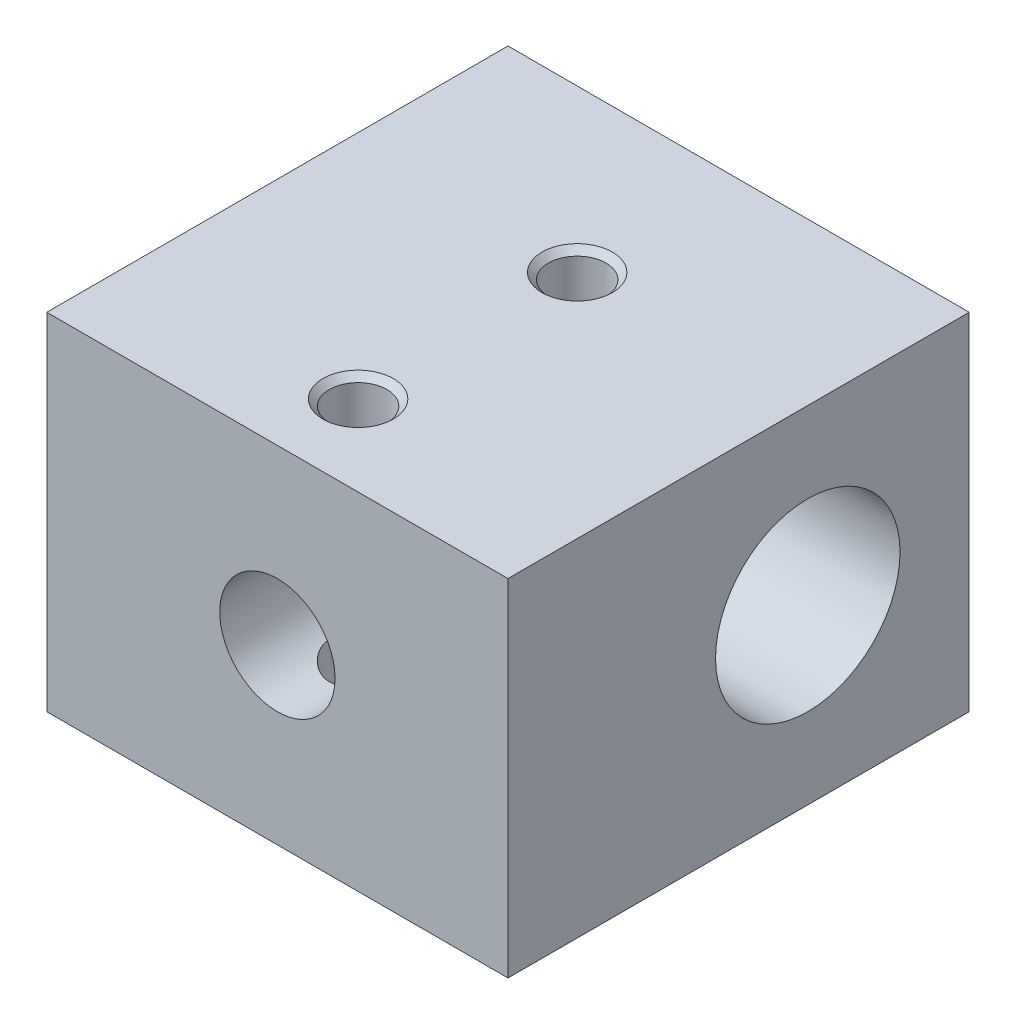
ISO-10303-21;
HEADER;
FILE_DESCRIPTION(('STEP AP214'),'2;1');
FILE_NAME('part.step','',(''),(''),'','','');
FILE_SCHEMA(('AUTOMOTIVE_DESIGN { 1 0 10303 214 1 1 1 1 }'));
ENDSEC;
DATA;
#1=APPLICATION_CONTEXT('core data for automotive mechanical design processes');
#2=APPLICATION_PROTOCOL_DEFINITION('international standard','automotive_design',2000,#1);
#3=PRODUCT_CONTEXT('',#1,'mechanical');
#4=PRODUCT('Part','Part','',(#3));
#5=PRODUCT_RELATED_PRODUCT_CATEGORY('part','',(#4));
#6=PRODUCT_DEFINITION_FORMATION('','',#4);
#7=PRODUCT_DEFINITION_CONTEXT('part definition',#1,'design');
#8=PRODUCT_DEFINITION('design','',#6,#7);
#9=PRODUCT_DEFINITION_SHAPE('','',#8);
#10=(LENGTH_UNIT() NAMED_UNIT(*) SI_UNIT(.MILLI.,.METRE.));
#11=(NAMED_UNIT(*) PLANE_ANGLE_UNIT() SI_UNIT($,.RADIAN.));
#12=(NAMED_UNIT(*) SI_UNIT($,.STERADIAN.) SOLID_ANGLE_UNIT());
#13=UNCERTAINTY_MEASURE_WITH_UNIT(LENGTH_MEASURE(1.E-05),#10,'distance_accuracy_value','');
#14=(GEOMETRIC_REPRESENTATION_CONTEXT(3) GLOBAL_UNCERTAINTY_ASSIGNED_CONTEXT((#13)) GLOBAL_UNIT_ASSIGNED_CONTEXT((#10,
#11,#12)) REPRESENTATION_CONTEXT('',''));
#15=CARTESIAN_POINT('',(0.,0.,0.));
#16=DIRECTION('',(0.,0.,1.));
#17=DIRECTION('',(1.,0.,0.));
#18=AXIS2_PLACEMENT_3D('',#15,#16,#17);
#19=CARTESIAN_POINT('',(0.,15.,0.));
#20=DIRECTION('',(0.,-1.,0.));
#21=DIRECTION('',(0.,0.,-1.));
#22=AXIS2_PLACEMENT_3D('',#19,#20,#21);
#23=PLANE('',#22);
#24=CARTESIAN_POINT('',(10.,15.,-3.5));
#25=DIRECTION('',(0.,1.,0.));
#26=DIRECTION('',(0.,0.,1.));
#27=AXIS2_PLACEMENT_3D('',#24,#25,#26);
#28=CIRCLE('',#27,1.525);
#29=CARTESIAN_POINT('',(10.,15.,-1.975));
#30=VERTEX_POINT('',#29);
#31=EDGE_CURVE('E219',#30,#30,#28,.T.);
#32=ORIENTED_EDGE('',*,*,#31,.F.);
#33=EDGE_LOOP('',(#32));
#34=FACE_BOUND('',#33,.T.);
#35=DIRECTION('',(0.,0.,1.));
#36=VECTOR('',#35,1.);
#37=CARTESIAN_POINT('',(0.,15.,0.));
#38=LINE('',#37,#36);
#39=CARTESIAN_POINT('',(0.,15.,-20.));
#40=VERTEX_POINT('',#39);
#41=CARTESIAN_POINT('',(0.,15.,0.));
#42=VERTEX_POINT('',#41);
#43=EDGE_CURVE('E104',#40,#42,#38,.T.);
#44=ORIENTED_EDGE('',*,*,#43,.T.);
#45=DIRECTION('',(1.,0.,0.));
#46=VECTOR('',#45,1.);
#47=CARTESIAN_POINT('',(0.,15.,0.));
#48=LINE('',#47,#46);
#49=CARTESIAN_POINT('',(20.,15.,0.));
#50=VERTEX_POINT('',#49);
#51=EDGE_CURVE('E99',#42,#50,#48,.T.);
#52=ORIENTED_EDGE('',*,*,#51,.T.);
#53=DIRECTION('',(0.,0.,-1.));
#54=VECTOR('',#53,1.);
#55=CARTESIAN_POINT('',(20.,15.,0.));
#56=LINE('',#55,#54);
#57=CARTESIAN_POINT('',(20.,15.,-20.));
#58=VERTEX_POINT('',#57);
#59=EDGE_CURVE('E102',#50,#58,#56,.T.);
#60=ORIENTED_EDGE('',*,*,#59,.T.);
#61=DIRECTION('',(-1.,0.,0.));
#62=VECTOR('',#61,1.);
#63=CARTESIAN_POINT('',(0.,15.,-20.));
#64=LINE('',#63,#62);
#65=EDGE_CURVE('E69',#58,#40,#64,.T.);
#66=ORIENTED_EDGE('',*,*,#65,.T.);
#67=EDGE_LOOP('',(#44,#52,#60,#66));
#68=FACE_BOUND('',#67,.T.);
#69=CARTESIAN_POINT('',(10.,15.,-13.));
#70=DIRECTION('',(0.,1.,0.));
#71=DIRECTION('',(0.,0.,1.));
#72=AXIS2_PLACEMENT_3D('',#69,#70,#71);
#73=CIRCLE('',#72,1.525);
#74=CARTESIAN_POINT('',(10.,15.,-11.475));
#75=VERTEX_POINT('',#74);
#76=EDGE_CURVE('E211',#75,#75,#73,.T.);
#77=ORIENTED_EDGE('',*,*,#76,.F.);
#78=EDGE_LOOP('',(#77));
#79=FACE_BOUND('',#78,.T.);
#80=ADVANCED_FACE('F45',(#34,#68,#79),#23,.F.);
#81=CARTESIAN_POINT('',(0.,0.,0.));
#82=DIRECTION('',(0.,-1.,0.));
#83=DIRECTION('',(0.,0.,-1.));
#84=AXIS2_PLACEMENT_3D('',#81,#82,#83);
#85=PLANE('',#84);
#86=CARTESIAN_POINT('',(10.,0.,-3.5));
#87=DIRECTION('',(0.,1.,0.));
#88=DIRECTION('',(0.,0.,1.));
#89=AXIS2_PLACEMENT_3D('',#86,#87,#88);
#90=CIRCLE('',#89,1.25);
#91=CARTESIAN_POINT('',(10.,0.,-2.25));
#92=VERTEX_POINT('',#91);
#93=EDGE_CURVE('E165',#92,#92,#90,.T.);
#94=ORIENTED_EDGE('',*,*,#93,.T.);
#95=EDGE_LOOP('',(#94));
#96=FACE_BOUND('',#95,.T.);
#97=DIRECTION('',(0.,0.,1.));
#98=VECTOR('',#97,1.);
#99=CARTESIAN_POINT('',(0.,0.,0.));
#100=LINE('',#99,#98);
#101=CARTESIAN_POINT('',(0.,0.,-20.));
#102=VERTEX_POINT('',#101);
#103=CARTESIAN_POINT('',(0.,0.,0.));
#104=VERTEX_POINT('',#103);
#105=EDGE_CURVE('E117',#102,#104,#100,.T.);
#106=ORIENTED_EDGE('',*,*,#105,.F.);
#107=DIRECTION('',(-1.,0.,0.));
#108=VECTOR('',#107,1.);
#109=CARTESIAN_POINT('',(0.,0.,-20.));
#110=LINE('',#109,#108);
#111=CARTESIAN_POINT('',(20.,0.,-20.));
#112=VERTEX_POINT('',#111);
#113=EDGE_CURVE('E92',#112,#102,#110,.T.);
#114=ORIENTED_EDGE('',*,*,#113,.F.);
#115=DIRECTION('',(0.,0.,-1.));
#116=VECTOR('',#115,1.);
#117=CARTESIAN_POINT('',(20.,0.,0.));
#118=LINE('',#117,#116);
#119=CARTESIAN_POINT('',(20.,0.,0.));
#120=VERTEX_POINT('',#119);
#121=EDGE_CURVE('E86',#120,#112,#118,.T.);
#122=ORIENTED_EDGE('',*,*,#121,.F.);
#123=DIRECTION('',(1.,0.,0.));
#124=VECTOR('',#123,1.);
#125=CARTESIAN_POINT('',(0.,0.,0.));
#126=LINE('',#125,#124);
#127=EDGE_CURVE('E108',#104,#120,#126,.T.);
#128=ORIENTED_EDGE('',*,*,#127,.F.);
#129=EDGE_LOOP('',(#106,#114,#122,#128));
#130=FACE_BOUND('',#129,.T.);
#131=CARTESIAN_POINT('',(10.,0.,-13.));
#132=DIRECTION('',(0.,1.,0.));
#133=DIRECTION('',(0.,0.,1.));
#134=AXIS2_PLACEMENT_3D('',#131,#132,#133);
#135=CIRCLE('',#134,1.25);
#136=CARTESIAN_POINT('',(10.,0.,-11.75));
#137=VERTEX_POINT('',#136);
#138=EDGE_CURVE('E135',#137,#137,#135,.T.);
#139=ORIENTED_EDGE('',*,*,#138,.T.);
#140=EDGE_LOOP('',(#139));
#141=FACE_BOUND('',#140,.T.);
#142=ADVANCED_FACE('F176',(#96,#130,#141),#85,.T.);
#143=CARTESIAN_POINT('',(0.,15.,0.));
#144=DIRECTION('',(1.,0.,0.));
#145=DIRECTION('',(0.,0.,-1.));
#146=AXIS2_PLACEMENT_3D('',#143,#144,#145);
#147=PLANE('',#146);
#148=CARTESIAN_POINT('',(0.,7.5,-13.));
#149=DIRECTION('',(1.,0.,0.));
#150=DIRECTION('',(0.,0.,-1.));
#151=AXIS2_PLACEMENT_3D('',#148,#149,#150);
#152=CIRCLE('',#151,4.);
#153=CARTESIAN_POINT('',(0.,7.5,-17.));
#154=VERTEX_POINT('',#153);
#155=EDGE_CURVE('E196',#154,#154,#152,.T.);
#156=ORIENTED_EDGE('',*,*,#155,.T.);
#157=EDGE_LOOP('',(#156));
#158=FACE_BOUND('',#157,.T.);
#159=ORIENTED_EDGE('',*,*,#105,.T.);
#160=DIRECTION('',(0.,-1.,0.));
#161=VECTOR('',#160,1.);
#162=CARTESIAN_POINT('',(0.,15.,0.));
#163=LINE('',#162,#161);
#164=EDGE_CURVE('E11',#42,#104,#163,.T.);
#165=ORIENTED_EDGE('',*,*,#164,.F.);
#166=ORIENTED_EDGE('',*,*,#43,.F.);
#167=DIRECTION('',(0.,-1.,0.));
#168=VECTOR('',#167,1.);
#169=CARTESIAN_POINT('',(0.,15.,-20.));
#170=LINE('',#169,#168);
#171=EDGE_CURVE('E113',#40,#102,#170,.T.);
#172=ORIENTED_EDGE('',*,*,#171,.T.);
#173=EDGE_LOOP('',(#159,#165,#166,#172));
#174=FACE_BOUND('',#173,.T.);
#175=ADVANCED_FACE('F47',(#158,#174),#147,.F.);
#176=CARTESIAN_POINT('',(0.,15.,0.));
#177=DIRECTION('',(0.,0.,-1.));
#178=DIRECTION('',(-1.,0.,0.));
#179=AXIS2_PLACEMENT_3D('',#176,#177,#178);
#180=PLANE('',#179);
#181=CARTESIAN_POINT('',(10.,7.5,0.));
#182=DIRECTION('',(0.,0.,1.));
#183=DIRECTION('',(1.,0.,0.));
#184=AXIS2_PLACEMENT_3D('',#181,#182,#183);
#185=CIRCLE('',#184,2.5);
#186=CARTESIAN_POINT('',(12.5,7.5,0.));
#187=VERTEX_POINT('',#186);
#188=EDGE_CURVE('E194',#187,#187,#185,.T.);
#189=ORIENTED_EDGE('',*,*,#188,.F.);
#190=EDGE_LOOP('',(#189));
#191=FACE_BOUND('',#190,.T.);
#192=ORIENTED_EDGE('',*,*,#127,.T.);
#193=DIRECTION('',(0.,-1.,0.));
#194=VECTOR('',#193,1.);
#195=CARTESIAN_POINT('',(20.,15.,0.));
#196=LINE('',#195,#194);
#197=EDGE_CURVE('E60',#50,#120,#196,.T.);
#198=ORIENTED_EDGE('',*,*,#197,.F.);
#199=ORIENTED_EDGE('',*,*,#51,.F.);
#200=ORIENTED_EDGE('',*,*,#164,.T.);
#201=EDGE_LOOP('',(#192,#198,#199,#200));
#202=FACE_BOUND('',#201,.T.);
#203=ADVANCED_FACE('F107',(#191,#202),#180,.F.);
#204=CARTESIAN_POINT('',(20.,15.,0.));
#205=DIRECTION('',(-1.,0.,0.));
#206=DIRECTION('',(0.,0.,1.));
#207=AXIS2_PLACEMENT_3D('',#204,#205,#206);
#208=PLANE('',#207);
#209=CARTESIAN_POINT('',(20.,7.5,-13.));
#210=DIRECTION('',(1.,0.,0.));
#211=DIRECTION('',(0.,0.,-1.));
#212=AXIS2_PLACEMENT_3D('',#209,#210,#211);
#213=CIRCLE('',#212,4.);
#214=CARTESIAN_POINT('',(20.,7.5,-17.));
#215=VERTEX_POINT('',#214);
#216=EDGE_CURVE('E201',#215,#215,#213,.T.);
#217=ORIENTED_EDGE('',*,*,#216,.F.);
#218=EDGE_LOOP('',(#217));
#219=FACE_BOUND('',#218,.T.);
#220=ORIENTED_EDGE('',*,*,#121,.T.);
#221=DIRECTION('',(0.,-1.,0.));
#222=VECTOR('',#221,1.);
#223=CARTESIAN_POINT('',(20.,15.,-20.));
#224=LINE('',#223,#222);
#225=EDGE_CURVE('E109',#58,#112,#224,.T.);
#226=ORIENTED_EDGE('',*,*,#225,.F.);
#227=ORIENTED_EDGE('',*,*,#59,.F.);
#228=ORIENTED_EDGE('',*,*,#197,.T.);
#229=EDGE_LOOP('',(#220,#226,#227,#228));
#230=FACE_BOUND('',#229,.T.);
#231=ADVANCED_FACE('F111',(#219,#230),#208,.F.);
#232=CARTESIAN_POINT('',(0.,15.,-20.));
#233=DIRECTION('',(0.,0.,1.));
#234=DIRECTION('',(1.,0.,0.));
#235=AXIS2_PLACEMENT_3D('',#232,#233,#234);
#236=PLANE('',#235);
#237=ORIENTED_EDGE('',*,*,#113,.T.);
#238=ORIENTED_EDGE('',*,*,#171,.F.);
#239=ORIENTED_EDGE('',*,*,#65,.F.);
#240=ORIENTED_EDGE('',*,*,#225,.T.);
#241=EDGE_LOOP('',(#237,#238,#239,#240));
#242=FACE_BOUND('',#241,.T.);
#243=ADVANCED_FACE('F171',(#242),#236,.F.);
#244=CARTESIAN_POINT('',(10.,7.5,-7.));
#245=DIRECTION('',(0.,0.,1.));
#246=DIRECTION('',(1.,0.,0.));
#247=AXIS2_PLACEMENT_3D('',#244,#245,#246);
#248=CYLINDRICAL_SURFACE('',#247,2.5);
#249=CARTESIAN_POINT('',(10.,5.,-2.25));
#250=CARTESIAN_POINT('',(9.93428504630877,5.00000358244811,-2.25000412789938));
#251=CARTESIAN_POINT('',(9.86849175037746,5.00261886225603,-2.2552125914021));
#252=CARTESIAN_POINT('',(9.73884970591447,5.01282304953255,-2.27581610042615));
#253=CARTESIAN_POINT('',(9.67500489160812,5.02042140213771,-2.29123049124706));
#254=CARTESIAN_POINT('',(9.55133306889928,5.0397965074586,-2.33149226077099));
#255=CARTESIAN_POINT('',(9.49149149632603,5.051557010281,-2.35630298031002));
#256=CARTESIAN_POINT('',(9.3769092289918,5.07817779355277,-2.41446327670618));
#257=CARTESIAN_POINT('',(9.32216813251244,5.09303782958087,-2.44781218031107));
#258=CARTESIAN_POINT('',(9.2156152277976,5.12554677177429,-2.52439656185662));
#259=CARTESIAN_POINT('',(9.16418098609736,5.1433100109058,-2.56810809904955));
#260=CARTESIAN_POINT('',(9.06902569391628,5.17925037191569,-2.66315184905879));
#261=CARTESIAN_POINT('',(9.02531052111654,5.19742779738706,-2.71448981471555));
#262=CARTESIAN_POINT('',(8.94343499943716,5.23376311003316,-2.82810418690423));
#263=CARTESIAN_POINT('',(8.90596833056046,5.25181016287335,-2.89092012293239));
#264=CARTESIAN_POINT('',(8.84228971638663,5.28392526534599,-3.02295916998277));
#265=CARTESIAN_POINT('',(8.81606973129209,5.29799615491263,-3.09217766090344));
#266=CARTESIAN_POINT('',(8.77733444726427,5.31927666202739,-3.2308313817774));
#267=CARTESIAN_POINT('',(8.76409267864945,5.32684660520358,-3.30000556508424));
#268=CARTESIAN_POINT('',(8.74946625836395,5.3352263756434,-3.43997354722434));
#269=CARTESIAN_POINT('',(8.74806988953366,5.3360428832089,-3.51076567608894));
#270=CARTESIAN_POINT('',(8.75664089103464,5.33111337178439,-3.64285753039421));
#271=CARTESIAN_POINT('',(8.76526930057898,5.32614045422483,-3.70428003902881));
#272=CARTESIAN_POINT('',(8.79132518867884,5.31154714082687,-3.8246523867163));
#273=CARTESIAN_POINT('',(8.80875547012794,5.30192526460279,-3.88360143163164));
#274=CARTESIAN_POINT('',(8.8522377745175,5.27890654484074,-3.99903641570707));
#275=CARTESIAN_POINT('',(8.87848116610501,5.26542699170002,-4.05543299848223));
#276=CARTESIAN_POINT('',(8.938697890415,5.23620744648245,-4.16329286573751));
#277=CARTESIAN_POINT('',(8.97267469523442,5.22046644024762,-4.21475391950011));
#278=CARTESIAN_POINT('',(9.05241743135902,5.18608552620893,-4.31815156592903));
#279=CARTESIAN_POINT('',(9.0991319270384,5.16733112204067,-4.36932109197019));
#280=CARTESIAN_POINT('',(9.20055552657329,5.13065470874491,-4.46341927323862));
#281=CARTESIAN_POINT('',(9.25526842928214,5.11273310051499,-4.50634399004235));
#282=CARTESIAN_POINT('',(9.37435436771019,5.07872515896295,-4.58460707628716));
#283=CARTESIAN_POINT('',(9.43905801050074,5.06276269797491,-4.61950059055717));
#284=CARTESIAN_POINT('',(9.57441723063901,5.03552648598447,-4.67762128630376));
#285=CARTESIAN_POINT('',(9.6450680296684,5.02424901320559,-4.70085773126896));
#286=CARTESIAN_POINT('',(9.78404188542412,5.00844582823205,-4.73309425464584));
#287=CARTESIAN_POINT('',(9.8520730868146,5.0034382712336,-4.74311404468347));
#288=CARTESIAN_POINT('',(9.98902550006331,4.99908733176123,-4.75183091391811));
#289=CARTESIAN_POINT('',(10.0579462748374,4.9997412659836,-4.75053335704935));
#290=CARTESIAN_POINT('',(10.1890412149825,5.00636009683199,-4.73724163947655));
#291=CARTESIAN_POINT('',(10.2513242600624,5.01190942889763,-4.72608433408746));
#292=CARTESIAN_POINT('',(10.3730086153774,5.02722285856476,-4.69470241013114));
#293=CARTESIAN_POINT('',(10.4324096071137,5.03698742082084,-4.6744767919333));
#294=CARTESIAN_POINT('',(10.5486107605621,5.06019685732913,-4.62500191695853));
#295=CARTESIAN_POINT('',(10.6052879962577,5.07373897787576,-4.59551118735398));
#296=CARTESIAN_POINT('',(10.7130767021237,5.10320032103614,-4.52861558044244));
#297=CARTESIAN_POINT('',(10.7641857872191,5.11912055542769,-4.49120733175821));
#298=CARTESIAN_POINT('',(10.8647096116133,5.15364723328169,-4.4052994683339));
#299=CARTESIAN_POINT('',(10.9134650972808,5.17236393939448,-4.35607141443304));
#300=CARTESIAN_POINT('',(11.0023204013916,5.20922010495157,-4.25009356091337));
#301=CARTESIAN_POINT('',(11.0424142321136,5.22735915773092,-4.19333860147953));
#302=CARTESIAN_POINT('',(11.1146348931221,5.26186009717415,-4.07044543224961));
#303=CARTESIAN_POINT('',(11.1462818698483,5.2780933792066,-4.00398591723925));
#304=CARTESIAN_POINT('',(11.1976035325173,5.30532409539842,-3.86561241538435));
#305=CARTESIAN_POINT('',(11.2172936448595,5.31632827199227,-3.79370559187351));
#306=CARTESIAN_POINT('',(11.2423271093121,5.33048123739166,-3.65386222142319));
#307=CARTESIAN_POINT('',(11.2488662455011,5.33428270674386,-3.5862071832137));
#308=CARTESIAN_POINT('',(11.250861442976,5.33543306692281,-3.45069116603659));
#309=CARTESIAN_POINT('',(11.2463223082805,5.33278475465559,-3.38283028907571));
#310=CARTESIAN_POINT('',(11.2274076569903,5.32202672437469,-3.25564562308498));
#311=CARTESIAN_POINT('',(11.2140103929285,5.31446131897008,-3.1961244123195));
#312=CARTESIAN_POINT('',(11.1789691977808,5.29536229765103,-3.08023985071912));
#313=CARTESIAN_POINT('',(11.1573226139498,5.28382740537905,-3.02387752238504));
#314=CARTESIAN_POINT('',(11.1047696816259,5.2571433704434,-2.91171893626674));
#315=CARTESIAN_POINT('',(11.0733389222706,5.24180347004761,-2.85621512271287));
#316=CARTESIAN_POINT('',(11.0026887145458,5.20955835456762,-2.75090682977427));
#317=CARTESIAN_POINT('',(10.9634652140483,5.19265232756847,-2.70110533685189));
#318=CARTESIAN_POINT('',(10.8727541583308,5.15672096050858,-2.60232252205298));
#319=CARTESIAN_POINT('',(10.8203555287627,5.13768770860664,-2.5541761220476));
#320=CARTESIAN_POINT('',(10.7076935077753,5.1015280968114,-2.46717127072046));
#321=CARTESIAN_POINT('',(10.647425904071,5.0844027673995,-2.42831782571714));
#322=CARTESIAN_POINT('',(10.5199144960249,5.05377488018621,-2.36095454654725));
#323=CARTESIAN_POINT('',(10.4526243799183,5.04029879296364,-2.33251978823571));
#324=CARTESIAN_POINT('',(10.3134276266177,5.01873323295668,-2.28773979010131));
#325=CARTESIAN_POINT('',(10.241534749529,5.01062845783835,-2.27136019146303));
#326=CARTESIAN_POINT('',(10.1407524331042,5.00380672612921,-2.25762823615519));
#327=CARTESIAN_POINT('',(10.1127023492994,5.00238293325998,-2.25477169892048));
#328=CARTESIAN_POINT('',(10.0564396647589,5.00047878777669,-2.25095666810399));
#329=CARTESIAN_POINT('',(10.0282270595592,4.99999846120296,-2.249998226911));
#330=CARTESIAN_POINT('',(10.,5.,-2.25));
#331=B_SPLINE_CURVE_WITH_KNOTS('',3,(#249,#250,#251,#252,#253,#254,#255,#256,#257,#258,#259,
#260,#261,#262,#263,#264,#265,#266,#267,#268,#269,#270,#271,#272,#273,#274,#275,#276,#277,#278,
#279,#280,#281,#282,#283,#284,#285,#286,#287,#288,#289,#290,#291,#292,#293,#294,#295,#296,#297,
#298,#299,#300,#301,#302,#303,#304,#305,#306,#307,#308,#309,#310,#311,#312,#313,#314,#315,#316,
#317,#318,#319,#320,#321,#322,#323,#324,#325,#326,#327,#328,#329,#330),.UNSPECIFIED.,.T.,.F.,(4,
2,2,2,2,2,2,2,2,2,2,2,2,2,2,2,2,2,2,2,2,2,2,2,2,2,2,2,2,2,2,2,2,2,2,2,2,2,2,2,4),(0.,
0.197030321775365,0.394435187136496,0.591077694365372,0.787704700726957,0.996227198397609,
1.20490779706754,1.4297715803844,1.65447434872851,1.86572515175286,2.07676696661275,
2.2625714051165,2.44843504907098,2.63862800210609,2.82890651575277,3.04331176667347,
3.25781918248357,3.4822877776805,3.70657771140349,3.91229113089181,4.11790705639344,
4.30758633132652,4.49728652038664,4.69241070034872,4.88761813435423,5.10199513305523,
5.31651985769289,5.54143352699591,5.76605639925971,5.96911634372966,6.17208824825005,
6.35572412805227,6.53941910979596,6.73545570969516,6.93159451423696,7.15156553440622,
7.37165479220714,7.59330017078655,7.81431135781161,7.8989410017212,7.98357298143557),.UNSPECIFIED.);
#332=CARTESIAN_POINT('',(10.,5.,-2.25));
#333=VERTEX_POINT('',#332);
#334=EDGE_CURVE('E49',#333,#333,#331,.T.);
#335=ORIENTED_EDGE('',*,*,#334,.T.);
#336=EDGE_LOOP('',(#335));
#337=FACE_BOUND('',#336,.T.);
#338=CARTESIAN_POINT('',(10.,10.,-2.25));
#339=CARTESIAN_POINT('',(10.0657149536912,9.99999641755189,-2.25000412789938));
#340=CARTESIAN_POINT('',(10.1315082496225,9.99738113774397,-2.25521259140209));
#341=CARTESIAN_POINT('',(10.2611502940855,9.98717695046745,-2.27581610042615));
#342=CARTESIAN_POINT('',(10.3249951083919,9.97957859786229,-2.29123049124706));
#343=CARTESIAN_POINT('',(10.4486669311007,9.96020349254139,-2.33149226077099));
#344=CARTESIAN_POINT('',(10.508508503674,9.948442989719,-2.35630298031002));
#345=CARTESIAN_POINT('',(10.6230907710082,9.92182220644723,-2.41446327670618));
#346=CARTESIAN_POINT('',(10.6778318674876,9.90696217041912,-2.44781218031107));
#347=CARTESIAN_POINT('',(10.7843847722024,9.87445322822571,-2.52439656185662));
#348=CARTESIAN_POINT('',(10.8358190139026,9.8566899890942,-2.56810809904955));
#349=CARTESIAN_POINT('',(10.9309743060837,9.82074962808431,-2.66315184905879));
#350=CARTESIAN_POINT('',(10.9746894788835,9.80257220261294,-2.71448981471555));
#351=CARTESIAN_POINT('',(11.0565650005628,9.76623688996684,-2.82810418690423));
#352=CARTESIAN_POINT('',(11.0940316694395,9.74818983712665,-2.89092012293239));
#353=CARTESIAN_POINT('',(11.1577102836134,9.71607473465401,-3.02295916998277));
#354=CARTESIAN_POINT('',(11.1839302687079,9.70200384508737,-3.09217766090344));
#355=CARTESIAN_POINT('',(11.2226655527357,9.68072333797261,-3.2308313817774));
#356=CARTESIAN_POINT('',(11.2359073213505,9.67315339479642,-3.30000556508424));
#357=CARTESIAN_POINT('',(11.2505337416361,9.6647736243566,-3.43997354722434));
#358=CARTESIAN_POINT('',(11.2519301104663,9.6639571167911,-3.51076567608894));
#359=CARTESIAN_POINT('',(11.2433591089654,9.66888662821561,-3.64285753039421));
#360=CARTESIAN_POINT('',(11.234730699421,9.67385954577517,-3.70428003902881));
#361=CARTESIAN_POINT('',(11.2086748113212,9.68845285917313,-3.8246523867163));
#362=CARTESIAN_POINT('',(11.1912445298721,9.69807473539721,-3.88360143163164));
#363=CARTESIAN_POINT('',(11.1477622254825,9.72109345515926,-3.99903641570707));
#364=CARTESIAN_POINT('',(11.121518833895,9.73457300829998,-4.05543299848223));
#365=CARTESIAN_POINT('',(11.061302109585,9.76379255351755,-4.16329286573751));
#366=CARTESIAN_POINT('',(11.0273253047656,9.77953355975238,-4.21475391950011));
#367=CARTESIAN_POINT('',(10.947582568641,9.81391447379107,-4.31815156592903));
#368=CARTESIAN_POINT('',(10.9008680729616,9.83266887795933,-4.3693210919702));
#369=CARTESIAN_POINT('',(10.7994444734267,9.86934529125509,-4.46341927323862));
#370=CARTESIAN_POINT('',(10.7447315707179,9.88726689948501,-4.50634399004235));
#371=CARTESIAN_POINT('',(10.6256456322898,9.92127484103705,-4.58460707628716));
#372=CARTESIAN_POINT('',(10.5609419894993,9.93723730202509,-4.61950059055717));
#373=CARTESIAN_POINT('',(10.425582769361,9.96447351401553,-4.67762128630376));
#374=CARTESIAN_POINT('',(10.3549319703316,9.97575098679441,-4.70085773126896));
#375=CARTESIAN_POINT('',(10.2159581145759,9.99155417176795,-4.73309425464584));
#376=CARTESIAN_POINT('',(10.1479269131854,9.99656172876639,-4.74311404468347));
#377=CARTESIAN_POINT('',(10.0109744999367,10.0009126682388,-4.75183091391811));
#378=CARTESIAN_POINT('',(9.94205372516262,10.0002587340164,-4.75053335704935));
#379=CARTESIAN_POINT('',(9.81095878501751,9.99363990316801,-4.73724163947655));
#380=CARTESIAN_POINT('',(9.74867573993756,9.98809057110237,-4.72608433408746));
#381=CARTESIAN_POINT('',(9.6269913846226,9.97277714143524,-4.69470241013114));
#382=CARTESIAN_POINT('',(9.56759039288625,9.96301257917916,-4.6744767919333));
#383=CARTESIAN_POINT('',(9.45138923943792,9.93980314267087,-4.62500191695853));
#384=CARTESIAN_POINT('',(9.39471200374231,9.92626102212424,-4.59551118735398));
#385=CARTESIAN_POINT('',(9.28692329787635,9.89679967896386,-4.52861558044244));
#386=CARTESIAN_POINT('',(9.2358142127809,9.88087944457232,-4.49120733175821));
#387=CARTESIAN_POINT('',(9.13529038838668,9.84635276671831,-4.4052994683339));
#388=CARTESIAN_POINT('',(9.0865349027192,9.82763606060552,-4.35607141443304));
#389=CARTESIAN_POINT('',(8.99767959860845,9.79077989504843,-4.25009356091337));
#390=CARTESIAN_POINT('',(8.95758576788645,9.77264084226908,-4.19333860147953));
#391=CARTESIAN_POINT('',(8.88536510687788,9.73813990282585,-4.07044543224961));
#392=CARTESIAN_POINT('',(8.85371813015171,9.7219066207934,-4.00398591723925));
#393=CARTESIAN_POINT('',(8.80239646748275,9.69467590460158,-3.86561241538435));
#394=CARTESIAN_POINT('',(8.78270635514054,9.68367172800773,-3.79370559187351));
#395=CARTESIAN_POINT('',(8.75767289068791,9.66951876260834,-3.65386222142319));
#396=CARTESIAN_POINT('',(8.75113375449892,9.66571729325614,-3.5862071832137));
#397=CARTESIAN_POINT('',(8.74913855702402,9.66456693307719,-3.45069116603659));
#398=CARTESIAN_POINT('',(8.7536776917195,9.66721524534441,-3.38283028907571));
#399=CARTESIAN_POINT('',(8.77259234300968,9.67797327562531,-3.25564562308498));
#400=CARTESIAN_POINT('',(8.7859896070715,9.68553868102992,-3.1961244123195));
#401=CARTESIAN_POINT('',(8.8210308022192,9.70463770234897,-3.08023985071912));
#402=CARTESIAN_POINT('',(8.84267738605024,9.71617259462095,-3.02387752238504));
#403=CARTESIAN_POINT('',(8.89523031837415,9.7428566295566,-2.91171893626674));
#404=CARTESIAN_POINT('',(8.92666107772943,9.75819652995238,-2.85621512271287));
#405=CARTESIAN_POINT('',(8.99731128545421,9.79044164543238,-2.75090682977427));
#406=CARTESIAN_POINT('',(9.03653478595169,9.80734767243153,-2.70110533685189));
#407=CARTESIAN_POINT('',(9.1272458416692,9.84327903949141,-2.60232252205298));
#408=CARTESIAN_POINT('',(9.17964447123729,9.86231229139336,-2.5541761220476));
#409=CARTESIAN_POINT('',(9.29230649222465,9.8984719031886,-2.46717127072046));
#410=CARTESIAN_POINT('',(9.35257409592902,9.9155972326005,-2.42831782571714));
#411=CARTESIAN_POINT('',(9.48008550397507,9.94622511981379,-2.36095454654725));
#412=CARTESIAN_POINT('',(9.54737562008173,9.95970120703636,-2.33251978823571));
#413=CARTESIAN_POINT('',(9.68657237338226,9.98126676704332,-2.28773979010131));
#414=CARTESIAN_POINT('',(9.75846525047104,9.98937154216165,-2.27136019146303));
#415=CARTESIAN_POINT('',(9.85924756689577,9.99619327387079,-2.25762823615519));
#416=CARTESIAN_POINT('',(9.88729765070063,9.99761706674002,-2.25477169892048));
#417=CARTESIAN_POINT('',(9.94356033524105,9.99952121222331,-2.25095666810399));
#418=CARTESIAN_POINT('',(9.97177294044077,10.000001538797,-2.249998226911));
#419=CARTESIAN_POINT('',(10.,10.,-2.25));
#420=B_SPLINE_CURVE_WITH_KNOTS('',3,(#338,#339,#340,#341,#342,#343,#344,#345,#346,#347,#348,
#349,#350,#351,#352,#353,#354,#355,#356,#357,#358,#359,#360,#361,#362,#363,#364,#365,#366,#367,
#368,#369,#370,#371,#372,#373,#374,#375,#376,#377,#378,#379,#380,#381,#382,#383,#384,#385,#386,
#387,#388,#389,#390,#391,#392,#393,#394,#395,#396,#397,#398,#399,#400,#401,#402,#403,#404,#405,
#406,#407,#408,#409,#410,#411,#412,#413,#414,#415,#416,#417,#418,#419),.UNSPECIFIED.,.T.,.F.,(4,
2,2,2,2,2,2,2,2,2,2,2,2,2,2,2,2,2,2,2,2,2,2,2,2,2,2,2,2,2,2,2,2,2,2,2,2,2,2,2,4),(0.,
0.197030321775365,0.394435187136496,0.591077694365372,0.787704700726957,0.996227198397609,
1.20490779706754,1.42977158038441,1.65447434872851,1.86572515175286,2.07676696661275,
2.2625714051165,2.44843504907098,2.63862800210609,2.82890651575277,3.04331176667348,
3.25781918248357,3.4822877776805,3.70657771140349,3.91229113089181,4.11790705639344,
4.30758633132652,4.49728652038664,4.69241070034873,4.88761813435423,5.10199513305523,
5.31651985769289,5.54143352699591,5.76605639925971,5.96911634372966,6.17208824825005,
6.35572412805227,6.53941910979596,6.73545570969516,6.93159451423696,7.15156553440622,
7.37165479220714,7.59330017078655,7.81431135781161,7.8989410017212,7.98357298143557),.UNSPECIFIED.);
#421=CARTESIAN_POINT('',(10.,10.,-2.25));
#422=VERTEX_POINT('',#421);
#423=EDGE_CURVE('E160',#422,#422,#420,.T.);
#424=ORIENTED_EDGE('',*,*,#423,.T.);
#425=EDGE_LOOP('',(#424));
#426=FACE_BOUND('',#425,.T.);
#427=CARTESIAN_POINT('',(10.,7.5,-7.));
#428=DIRECTION('',(0.,0.,1.));
#429=DIRECTION('',(1.,0.,0.));
#430=AXIS2_PLACEMENT_3D('',#427,#428,#429);
#431=CIRCLE('',#430,2.5);
#432=CARTESIAN_POINT('',(12.5,7.5,-7.));
#433=VERTEX_POINT('',#432);
#434=EDGE_CURVE('E120',#433,#433,#431,.T.);
#435=ORIENTED_EDGE('',*,*,#434,.F.);
#436=EDGE_LOOP('',(#435));
#437=FACE_BOUND('',#436,.T.);
#438=ORIENTED_EDGE('',*,*,#188,.T.);
#439=EDGE_LOOP('',(#438));
#440=FACE_BOUND('',#439,.T.);
#441=ADVANCED_FACE('F166',(#337,#426,#437,#440),#248,.F.);
#442=CARTESIAN_POINT('',(10.,7.5,-7.));
#443=DIRECTION('',(0.,0.,1.));
#444=DIRECTION('',(1.,0.,0.));
#445=AXIS2_PLACEMENT_3D('',#442,#443,#444);
#446=PLANE('',#445);
#447=ORIENTED_EDGE('',*,*,#434,.T.);
#448=EDGE_LOOP('',(#447));
#449=FACE_BOUND('',#448,.T.);
#450=ADVANCED_FACE('F170',(#449),#446,.T.);
#451=CARTESIAN_POINT('',(0.,7.5,-13.));
#452=DIRECTION('',(1.,0.,0.));
#453=DIRECTION('',(0.,0.,-1.));
#454=AXIS2_PLACEMENT_3D('',#451,#452,#453);
#455=CYLINDRICAL_SURFACE('',#454,4.);
#456=CARTESIAN_POINT('',(10.,3.70032896160734,-11.75));
#457=CARTESIAN_POINT('',(9.93165296389066,3.70032854038064,-11.7500004621995));
#458=CARTESIAN_POINT('',(9.8633012312968,3.69846468494958,-11.7556246120851));
#459=CARTESIAN_POINT('',(9.7286058391222,3.69124361001123,-11.7779082459867));
#460=CARTESIAN_POINT('',(9.66226272726784,3.68588544646864,-11.7945707121749));
#461=CARTESIAN_POINT('',(9.533555098068,3.6723406116404,-11.8383021177644));
#462=CARTESIAN_POINT('',(9.47118376689432,3.66415894805683,-11.8653526426332));
#463=CARTESIAN_POINT('',(9.35184730413599,3.64589593781312,-11.9290308582684));
#464=CARTESIAN_POINT('',(9.29488313003988,3.6358142556416,-11.9656602409437));
#465=CARTESIAN_POINT('',(9.18602113250651,3.6144987233138,-12.0488039293777));
#466=CARTESIAN_POINT('',(9.13433639056402,3.6032387661522,-12.0955906002796));
#467=CARTESIAN_POINT('',(9.03940398679082,3.58105754139665,-12.1971379535445));
#468=CARTESIAN_POINT('',(8.99615750305516,3.57013632127373,-12.2518997474814));
#469=CARTESIAN_POINT('',(8.91838893698876,3.54956446609922,-12.3693740875066));
#470=CARTESIAN_POINT('',(8.88408629616855,3.5399481543722,-12.4322384434799));
#471=CARTESIAN_POINT('',(8.82662395014446,3.52337448166982,-12.5631957671466));
#472=CARTESIAN_POINT('',(8.80346162585042,3.51641649580081,-12.631287501513));
#473=CARTESIAN_POINT('',(8.76964887190294,3.50612824179138,-12.7685356430339));
#474=CARTESIAN_POINT('',(8.75863425021215,3.50269261015857,-12.8375942845318));
#475=CARTESIAN_POINT('',(8.74827565356248,3.49946404123985,-12.9766591860155));
#476=CARTESIAN_POINT('',(8.74892902564117,3.49967027589935,-13.0466652269731));
#477=CARTESIAN_POINT('',(8.76164829158595,3.50362883867463,-13.1830744803547));
#478=CARTESIAN_POINT('',(8.77331938351303,3.50725849027843,-13.249518634314));
#479=CARTESIAN_POINT('',(8.80709499004301,3.51750517439145,-13.3794530633478));
#480=CARTESIAN_POINT('',(8.82920018508656,3.52412240172866,-13.4429431454812));
#481=CARTESIAN_POINT('',(8.88347018907489,3.53976540270468,-13.5660781031548));
#482=CARTESIAN_POINT('',(8.91575480856303,3.54881966383043,-13.6256664056228));
#483=CARTESIAN_POINT('',(8.98937109970456,3.56838277046438,-13.738702511152));
#484=CARTESIAN_POINT('',(9.03070505913784,3.57889198355416,-13.7921487562088));
#485=CARTESIAN_POINT('',(9.1232736348013,3.60076329265354,-13.8937376984539));
#486=CARTESIAN_POINT('',(9.1748490688412,3.61214268010916,-13.9415665490942));
#487=CARTESIAN_POINT('',(9.28539510182447,3.63409384559588,-14.0279897425954));
#488=CARTESIAN_POINT('',(9.34436657057501,3.64466552840154,-14.0665829977534));
#489=CARTESIAN_POINT('',(9.46891746885985,3.66389153351026,-14.1338046501977));
#490=CARTESIAN_POINT('',(9.53456340904239,3.67252309645677,-14.1623168070268));
#491=CARTESIAN_POINT('',(9.67005949189535,3.68662454661087,-14.2077834594851));
#492=CARTESIAN_POINT('',(9.73990811421048,3.69209556966707,-14.2247421076579));
#493=CARTESIAN_POINT('',(9.87881995256584,3.69900436608128,-14.2460148518571));
#494=CARTESIAN_POINT('',(9.94780199623211,3.70059533610304,-14.2508095435371));
#495=CARTESIAN_POINT('',(10.0855897414982,3.69998922536016,-14.2489674449831));
#496=CARTESIAN_POINT('',(10.1543954687005,3.69779272991611,-14.2423324211146));
#497=CARTESIAN_POINT('',(10.2878082966516,3.69001042517126,-14.2182487351314));
#498=CARTESIAN_POINT('',(10.352479274074,3.68452445898269,-14.2011183116054));
#499=CARTESIAN_POINT('',(10.478021791996,3.6708871266834,-14.1569037366103));
#500=CARTESIAN_POINT('',(10.5388927109212,3.66273532587613,-14.1298179617115));
#501=CARTESIAN_POINT('',(10.6570391097718,3.64439460346844,-14.0655751065587));
#502=CARTESIAN_POINT('',(10.7141614155928,3.63415396510267,-14.0281514748856));
#503=CARTESIAN_POINT('',(10.8214903463619,3.61289651027172,-13.9446064086798));
#504=CARTESIAN_POINT('',(10.8716951689253,3.60187949264298,-13.8984827146908));
#505=CARTESIAN_POINT('',(10.9659103659128,3.57975812437321,-13.7965729477536));
#506=CARTESIAN_POINT('',(11.0095777861399,3.56866907714321,-13.7404656497885));
#507=CARTESIAN_POINT('',(11.0868910433213,3.54810940156322,-13.6214515456514));
#508=CARTESIAN_POINT('',(11.120537339311,3.53863869909054,-13.5585450511086));
#509=CARTESIAN_POINT('',(11.1765305624717,3.52243688071488,-13.4281055233318));
#510=CARTESIAN_POINT('',(11.1989592878437,3.515686004388,-13.3606101842838));
#511=CARTESIAN_POINT('',(11.2320725385897,3.50559757351424,-13.2225572540564));
#512=CARTESIAN_POINT('',(11.2427607390835,3.50225895085723,-13.1520006283404));
#513=CARTESIAN_POINT('',(11.2517910017496,3.49944196595539,-13.0129849366489));
#514=CARTESIAN_POINT('',(11.2506284501708,3.49980870592611,-12.9445608080535));
#515=CARTESIAN_POINT('',(11.2371881889513,3.50399021918952,-12.8089267780768));
#516=CARTESIAN_POINT('',(11.2249112040081,3.50780476767381,-12.7417167978204));
#517=CARTESIAN_POINT('',(11.1899059907777,3.51840429155205,-12.6112448815192));
#518=CARTESIAN_POINT('',(11.1673103921546,3.52515152039795,-12.5479440815505));
#519=CARTESIAN_POINT('',(11.1124291727915,3.5409205441205,-12.4260015744999));
#520=CARTESIAN_POINT('',(11.0801418900266,3.54994272908642,-12.3673606687255));
#521=CARTESIAN_POINT('',(11.0055272416556,3.56970103116624,-12.2542383050303));
#522=CARTESIAN_POINT('',(10.962896477536,3.58048490249038,-12.1999653929469));
#523=CARTESIAN_POINT('',(10.8693401105565,3.60241263452939,-12.0991792086007));
#524=CARTESIAN_POINT('',(10.8184120258606,3.61355660215174,-12.0526682664958));
#525=CARTESIAN_POINT('',(10.7076842801589,3.63538107422562,-11.9671713408875));
#526=CARTESIAN_POINT('',(10.6476465968834,3.64603399136544,-11.9284857200529));
#527=CARTESIAN_POINT('',(10.5216018797309,3.66519874720469,-11.8617952925148));
#528=CARTESIAN_POINT('',(10.4555972735497,3.67371145138614,-11.8337861659645));
#529=CARTESIAN_POINT('',(10.3252773826853,3.68693439559673,-11.7912881956421));
#530=CARTESIAN_POINT('',(10.2612974525484,3.69190684956251,-11.7758506016213));
#531=CARTESIAN_POINT('',(10.1315461679035,3.69860393517602,-11.755207541839));
#532=CARTESIAN_POINT('',(10.0657752587985,3.70032936698402,-11.7499995551922));
#533=CARTESIAN_POINT('',(10.,3.70032896160734,-11.75));
#534=B_SPLINE_CURVE_WITH_KNOTS('',3,(#456,#457,#458,#459,#460,#461,#462,#463,#464,#465,#466,
#467,#468,#469,#470,#471,#472,#473,#474,#475,#476,#477,#478,#479,#480,#481,#482,#483,#484,#485,
#486,#487,#488,#489,#490,#491,#492,#493,#494,#495,#496,#497,#498,#499,#500,#501,#502,#503,#504,
#505,#506,#507,#508,#509,#510,#511,#512,#513,#514,#515,#516,#517,#518,#519,#520,#521,#522,#523,
#524,#525,#526,#527,#528,#529,#530,#531,#532,#533),.UNSPECIFIED.,.T.,.F.,(4,2,2,2,2,2,2,2,2,2,2,
2,2,2,2,2,2,2,2,2,2,2,2,2,2,2,2,2,2,2,2,2,2,2,2,2,2,2,4),(0.,0.20479813754849,0.409651627059736,
0.614143644118583,0.818671804924949,1.02957080550838,1.24049922941123,1.45619821963733,
1.67184647417922,1.88083722835533,2.08978046471774,2.2915098296975,2.49325235190093,
2.69746404608409,2.90172742713187,3.11450338937333,3.32730439853776,3.54248470934453,
3.75758763952752,3.96404933287935,4.17047912219089,4.37093972044362,4.57143302253209,
4.7776761330961,4.98397288011879,5.19881937811511,5.41365603317086,5.62690239290997,
5.84008198140584,6.04438802439524,6.24868074692306,6.45041846514758,6.65219079911651,
6.86080693105214,7.06948557772189,7.28507795501704,7.50058300803821,7.69772354371385,
7.89481549188778),.UNSPECIFIED.);
#535=CARTESIAN_POINT('',(10.,3.70032896160734,-11.75));
#536=VERTEX_POINT('',#535);
#537=EDGE_CURVE('E134',#536,#536,#534,.T.);
#538=ORIENTED_EDGE('',*,*,#537,.T.);
#539=EDGE_LOOP('',(#538));
#540=FACE_BOUND('',#539,.T.);
#541=CARTESIAN_POINT('',(10.,11.2996710383927,-11.75));
#542=CARTESIAN_POINT('',(10.0683470361093,11.2996714596194,-11.7500004621995));
#543=CARTESIAN_POINT('',(10.1366987687032,11.3015353150504,-11.7556246120851));
#544=CARTESIAN_POINT('',(10.2713941608778,11.3087563899888,-11.7779082459867));
#545=CARTESIAN_POINT('',(10.3377372727322,11.3141145535314,-11.7945707121749));
#546=CARTESIAN_POINT('',(10.466444901932,11.3276593883596,-11.8383021177644));
#547=CARTESIAN_POINT('',(10.5288162331057,11.3358410519432,-11.8653526426332));
#548=CARTESIAN_POINT('',(10.648152695864,11.3541040621869,-11.9290308582684));
#549=CARTESIAN_POINT('',(10.7051168699601,11.3641857443584,-11.9656602409437));
#550=CARTESIAN_POINT('',(10.8139788674935,11.3855012766862,-12.0488039293777));
#551=CARTESIAN_POINT('',(10.865663609436,11.3967612338478,-12.0955906002796));
#552=CARTESIAN_POINT('',(10.9605960132092,11.4189424586034,-12.1971379535445));
#553=CARTESIAN_POINT('',(11.0038424969448,11.4298636787263,-12.2518997474814));
#554=CARTESIAN_POINT('',(11.0816110630112,11.4504355339008,-12.3693740875066));
#555=CARTESIAN_POINT('',(11.1159137038315,11.4600518456278,-12.4322384434799));
#556=CARTESIAN_POINT('',(11.1733760498555,11.4766255183302,-12.5631957671466));
#557=CARTESIAN_POINT('',(11.1965383741496,11.4835835041992,-12.6312875015129));
#558=CARTESIAN_POINT('',(11.2303511280971,11.4938717582086,-12.7685356430339));
#559=CARTESIAN_POINT('',(11.2413657497878,11.4973073898414,-12.8375942845318));
#560=CARTESIAN_POINT('',(11.2517243464375,11.5005359587601,-12.9766591860155));
#561=CARTESIAN_POINT('',(11.2510709743588,11.5003297241006,-13.0466652269731));
#562=CARTESIAN_POINT('',(11.2383517084141,11.4963711613254,-13.1830744803547));
#563=CARTESIAN_POINT('',(11.226680616487,11.4927415097216,-13.249518634314));
#564=CARTESIAN_POINT('',(11.192905009957,11.4824948256085,-13.3794530633478));
#565=CARTESIAN_POINT('',(11.1707998149134,11.4758775982713,-13.4429431454812));
#566=CARTESIAN_POINT('',(11.1165298109251,11.4602345972953,-13.5660781031548));
#567=CARTESIAN_POINT('',(11.084245191437,11.4511803361696,-13.6256664056228));
#568=CARTESIAN_POINT('',(11.0106289002954,11.4316172295356,-13.738702511152));
#569=CARTESIAN_POINT('',(10.9692949408622,11.4211080164458,-13.7921487562088));
#570=CARTESIAN_POINT('',(10.8767263651987,11.3992367073465,-13.8937376984539));
#571=CARTESIAN_POINT('',(10.8251509311588,11.3878573198908,-13.9415665490942));
#572=CARTESIAN_POINT('',(10.7146048981755,11.3659061544041,-14.0279897425954));
#573=CARTESIAN_POINT('',(10.655633429425,11.3553344715985,-14.0665829977534));
#574=CARTESIAN_POINT('',(10.5310825311402,11.3361084664897,-14.1338046501977));
#575=CARTESIAN_POINT('',(10.4654365909576,11.3274769035432,-14.1623168070268));
#576=CARTESIAN_POINT('',(10.3299405081047,11.3133754533891,-14.2077834594851));
#577=CARTESIAN_POINT('',(10.2600918857895,11.3079044303329,-14.2247421076579));
#578=CARTESIAN_POINT('',(10.1211800474342,11.3009956339187,-14.2460148518571));
#579=CARTESIAN_POINT('',(10.0521980037679,11.299404663897,-14.2508095435371));
#580=CARTESIAN_POINT('',(9.91441025850184,11.3000107746398,-14.2489674449831));
#581=CARTESIAN_POINT('',(9.84560453129954,11.3022072700839,-14.2423324211146));
#582=CARTESIAN_POINT('',(9.71219170334836,11.3099895748287,-14.2182487351314));
#583=CARTESIAN_POINT('',(9.64752072592601,11.3154755410173,-14.2011183116054));
#584=CARTESIAN_POINT('',(9.52197820800396,11.3291128733166,-14.1569037366103));
#585=CARTESIAN_POINT('',(9.46110728907881,11.3372646741239,-14.1298179617115));
#586=CARTESIAN_POINT('',(9.34296089022825,11.3556053965316,-14.0655751065587));
#587=CARTESIAN_POINT('',(9.28583858440723,11.3658460348973,-14.0281514748856));
#588=CARTESIAN_POINT('',(9.17850965363809,11.3871034897283,-13.9446064086798));
#589=CARTESIAN_POINT('',(9.12830483107467,11.398120507357,-13.8984827146908));
#590=CARTESIAN_POINT('',(9.03408963408719,11.4202418756268,-13.7965729477536));
#591=CARTESIAN_POINT('',(8.99042221386014,11.4313309228568,-13.7404656497885));
#592=CARTESIAN_POINT('',(8.91310895667875,11.4518905984368,-13.6214515456514));
#593=CARTESIAN_POINT('',(8.87946266068897,11.4613613009095,-13.5585450511086));
#594=CARTESIAN_POINT('',(8.82346943752832,11.4775631192851,-13.4281055233318));
#595=CARTESIAN_POINT('',(8.80104071215632,11.484313995612,-13.3606101842838));
#596=CARTESIAN_POINT('',(8.7679274614103,11.4944024264858,-13.2225572540564));
#597=CARTESIAN_POINT('',(8.75723926091651,11.4977410491428,-13.1520006283404));
#598=CARTESIAN_POINT('',(8.74820899825038,11.5005580340446,-13.0129849366489));
#599=CARTESIAN_POINT('',(8.74937154982925,11.5001912940739,-12.9445608080535));
#600=CARTESIAN_POINT('',(8.7628118110487,11.4960097808105,-12.8089267780768));
#601=CARTESIAN_POINT('',(8.77508879599195,11.4921952323262,-12.7417167978204));
#602=CARTESIAN_POINT('',(8.81009400922228,11.481595708448,-12.6112448815192));
#603=CARTESIAN_POINT('',(8.83268960784537,11.474848479602,-12.5479440815505));
#604=CARTESIAN_POINT('',(8.88757082720848,11.4590794558795,-12.4260015744999));
#605=CARTESIAN_POINT('',(8.91985810997343,11.4500572709136,-12.3673606687255));
#606=CARTESIAN_POINT('',(8.99447275834444,11.4302989688338,-12.2542383050303));
#607=CARTESIAN_POINT('',(9.03710352246398,11.4195150975096,-12.1999653929469));
#608=CARTESIAN_POINT('',(9.13065988944347,11.3975873654706,-12.0991792086007));
#609=CARTESIAN_POINT('',(9.18158797413939,11.3864433978483,-12.0526682664958));
#610=CARTESIAN_POINT('',(9.2923157198411,11.3646189257744,-11.9671713408875));
#611=CARTESIAN_POINT('',(9.35235340311658,11.3539660086346,-11.9284857200529));
#612=CARTESIAN_POINT('',(9.47839812026914,11.3348012527953,-11.8617952925148));
#613=CARTESIAN_POINT('',(9.54440272645025,11.3262885486139,-11.8337861659645));
#614=CARTESIAN_POINT('',(9.67472261731467,11.3130656044033,-11.7912881956421));
#615=CARTESIAN_POINT('',(9.73870254745156,11.3080931504375,-11.7758506016213));
#616=CARTESIAN_POINT('',(9.86845383209649,11.301396064824,-11.755207541839));
#617=CARTESIAN_POINT('',(9.9342247412015,11.299670633016,-11.7499995551922));
#618=CARTESIAN_POINT('',(10.,11.2996710383927,-11.75));
#619=B_SPLINE_CURVE_WITH_KNOTS('',3,(#541,#542,#543,#544,#545,#546,#547,#548,#549,#550,#551,
#552,#553,#554,#555,#556,#557,#558,#559,#560,#561,#562,#563,#564,#565,#566,#567,#568,#569,#570,
#571,#572,#573,#574,#575,#576,#577,#578,#579,#580,#581,#582,#583,#584,#585,#586,#587,#588,#589,
#590,#591,#592,#593,#594,#595,#596,#597,#598,#599,#600,#601,#602,#603,#604,#605,#606,#607,#608,
#609,#610,#611,#612,#613,#614,#615,#616,#617,#618),.UNSPECIFIED.,.T.,.F.,(4,2,2,2,2,2,2,2,2,2,2,
2,2,2,2,2,2,2,2,2,2,2,2,2,2,2,2,2,2,2,2,2,2,2,2,2,2,2,4),(0.,0.204798137548489,
0.409651627059734,0.614143644118575,0.818671804924947,1.02957080550838,1.24049922941122,
1.45619821963733,1.67184647417922,1.88083722835533,2.08978046471774,2.2915098296975,
2.49325235190093,2.69746404608409,2.90172742713187,3.11450338937334,3.32730439853775,
3.54248470934453,3.75758763952752,3.96404933287935,4.17047912219088,4.37093972044362,
4.57143302253209,4.7776761330961,4.98397288011879,5.1988193781151,5.41365603317086,
5.62690239290997,5.84008198140584,6.04438802439524,6.24868074692306,6.45041846514758,
6.65219079911651,6.86080693105214,7.06948557772189,7.28507795501704,7.50058300803821,
7.69772354371385,7.89481549188778),.UNSPECIFIED.);
#620=CARTESIAN_POINT('',(10.,11.2996710383927,-11.75));
#621=VERTEX_POINT('',#620);
#622=EDGE_CURVE('E126',#621,#621,#619,.T.);
#623=ORIENTED_EDGE('',*,*,#622,.T.);
#624=EDGE_LOOP('',(#623));
#625=FACE_BOUND('',#624,.T.);
#626=ORIENTED_EDGE('',*,*,#155,.F.);
#627=EDGE_LOOP('',(#626));
#628=FACE_BOUND('',#627,.T.);
#629=ORIENTED_EDGE('',*,*,#216,.T.);
#630=EDGE_LOOP('',(#629));
#631=FACE_BOUND('',#630,.T.);
#632=ADVANCED_FACE('F139',(#540,#625,#628,#631),#455,.F.);
#633=CARTESIAN_POINT('',(10.,15.,-13.));
#634=DIRECTION('',(0.,1.,0.));
#635=DIRECTION('',(0.,0.,1.));
#636=AXIS2_PLACEMENT_3D('',#633,#634,#635);
#637=CONICAL_SURFACE('',#636,1.525,0.785398163397445);
#638=CARTESIAN_POINT('',(10.,14.725,-13.));
#639=DIRECTION('',(0.,1.,0.));
#640=DIRECTION('',(0.,0.,1.));
#641=AXIS2_PLACEMENT_3D('',#638,#639,#640);
#642=CIRCLE('',#641,1.25);
#643=CARTESIAN_POINT('',(10.,14.725,-11.75));
#644=VERTEX_POINT('',#643);
#645=EDGE_CURVE('E208',#644,#644,#642,.T.);
#646=ORIENTED_EDGE('',*,*,#645,.F.);
#647=EDGE_LOOP('',(#646));
#648=FACE_BOUND('',#647,.T.);
#649=ORIENTED_EDGE('',*,*,#76,.T.);
#650=EDGE_LOOP('',(#649));
#651=FACE_BOUND('',#650,.T.);
#652=ADVANCED_FACE('F149',(#648,#651),#637,.F.);
#653=CARTESIAN_POINT('',(10.,15.,-13.));
#654=DIRECTION('',(0.,1.,0.));
#655=DIRECTION('',(0.,0.,1.));
#656=AXIS2_PLACEMENT_3D('',#653,#654,#655);
#657=CYLINDRICAL_SURFACE('',#656,1.25);
#658=ORIENTED_EDGE('',*,*,#645,.T.);
#659=EDGE_LOOP('',(#658));
#660=FACE_BOUND('',#659,.T.);
#661=ORIENTED_EDGE('',*,*,#622,.F.);
#662=EDGE_LOOP('',(#661));
#663=FACE_BOUND('',#662,.T.);
#664=ADVANCED_FACE('F147',(#660,#663),#657,.F.);
#665=ORIENTED_EDGE('',*,*,#138,.F.);
#666=EDGE_LOOP('',(#665));
#667=FACE_BOUND('',#666,.T.);
#668=ORIENTED_EDGE('',*,*,#537,.F.);
#669=EDGE_LOOP('',(#668));
#670=FACE_BOUND('',#669,.T.);
#671=ADVANCED_FACE('F142',(#667,#670),#657,.F.);
#672=CARTESIAN_POINT('',(10.,15.,-3.5));
#673=DIRECTION('',(0.,1.,0.));
#674=DIRECTION('',(0.,0.,1.));
#675=AXIS2_PLACEMENT_3D('',#672,#673,#674);
#676=CYLINDRICAL_SURFACE('',#675,1.25);
#677=CARTESIAN_POINT('',(10.,14.725,-3.5));
#678=DIRECTION('',(0.,1.,0.));
#679=DIRECTION('',(0.,0.,1.));
#680=AXIS2_PLACEMENT_3D('',#677,#678,#679);
#681=CIRCLE('',#680,1.25);
#682=CARTESIAN_POINT('',(10.,14.725,-2.25));
#683=VERTEX_POINT('',#682);
#684=EDGE_CURVE('E216',#683,#683,#681,.T.);
#685=ORIENTED_EDGE('',*,*,#684,.T.);
#686=EDGE_LOOP('',(#685));
#687=FACE_BOUND('',#686,.T.);
#688=ORIENTED_EDGE('',*,*,#423,.F.);
#689=EDGE_LOOP('',(#688));
#690=FACE_BOUND('',#689,.T.);
#691=ADVANCED_FACE('F146',(#687,#690),#676,.F.);
#692=CARTESIAN_POINT('',(10.,15.,-3.5));
#693=DIRECTION('',(0.,1.,0.));
#694=DIRECTION('',(0.,0.,1.));
#695=AXIS2_PLACEMENT_3D('',#692,#693,#694);
#696=CONICAL_SURFACE('',#695,1.525,0.785398163397445);
#697=ORIENTED_EDGE('',*,*,#684,.F.);
#698=EDGE_LOOP('',(#697));
#699=FACE_BOUND('',#698,.T.);
#700=ORIENTED_EDGE('',*,*,#31,.T.);
#701=EDGE_LOOP('',(#700));
#702=FACE_BOUND('',#701,.T.);
#703=ADVANCED_FACE('F157',(#699,#702),#696,.F.);
#704=ORIENTED_EDGE('',*,*,#93,.F.);
#705=EDGE_LOOP('',(#704));
#706=FACE_BOUND('',#705,.T.);
#707=ORIENTED_EDGE('',*,*,#334,.F.);
#708=EDGE_LOOP('',(#707));
#709=FACE_BOUND('',#708,.T.);
#710=ADVANCED_FACE('F153',(#706,#709),#676,.F.);
#711=CLOSED_SHELL('',(#80,#142,#175,#203,#231,#243,#441,#450,#632,#652,#664,#671,#691,#703,#710));
#712=MANIFOLD_SOLID_BREP('B2',#711);
#713=ADVANCED_BREP_SHAPE_REPRESENTATION('',(#18,#712),#14);
#714=SHAPE_DEFINITION_REPRESENTATION(#9,#713);
ENDSEC;
END-ISO-10303-21;
